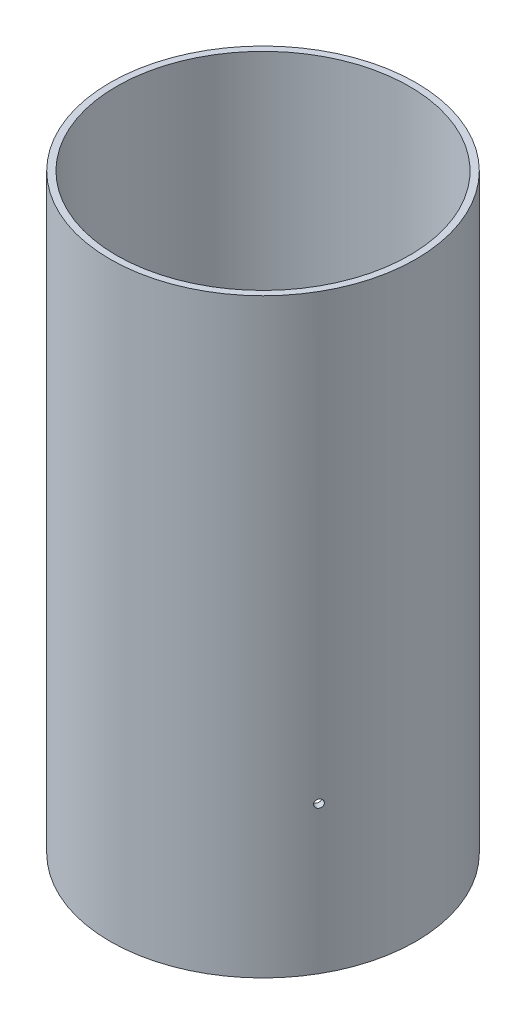
ISO-10303-21;
HEADER;
FILE_DESCRIPTION(('STEP AP214'),'2;1');
FILE_NAME('part.step','',(''),(''),'','','');
FILE_SCHEMA(('AUTOMOTIVE_DESIGN { 1 0 10303 214 1 1 1 1 }'));
ENDSEC;
DATA;
#1=APPLICATION_CONTEXT('core data for automotive mechanical design processes');
#2=APPLICATION_PROTOCOL_DEFINITION('international standard','automotive_design',2000,#1);
#3=PRODUCT_CONTEXT('',#1,'mechanical');
#4=PRODUCT('Part','Part','',(#3));
#5=PRODUCT_RELATED_PRODUCT_CATEGORY('part','',(#4));
#6=PRODUCT_DEFINITION_FORMATION('','',#4);
#7=PRODUCT_DEFINITION_CONTEXT('part definition',#1,'design');
#8=PRODUCT_DEFINITION('design','',#6,#7);
#9=PRODUCT_DEFINITION_SHAPE('','',#8);
#10=(LENGTH_UNIT() NAMED_UNIT(*) SI_UNIT(.MILLI.,.METRE.));
#11=(NAMED_UNIT(*) PLANE_ANGLE_UNIT() SI_UNIT($,.RADIAN.));
#12=(NAMED_UNIT(*) SI_UNIT($,.STERADIAN.) SOLID_ANGLE_UNIT());
#13=UNCERTAINTY_MEASURE_WITH_UNIT(LENGTH_MEASURE(1.E-05),#10,'distance_accuracy_value','');
#14=(GEOMETRIC_REPRESENTATION_CONTEXT(3) GLOBAL_UNCERTAINTY_ASSIGNED_CONTEXT((#13)) GLOBAL_UNIT_ASSIGNED_CONTEXT((#10,
#11,#12)) REPRESENTATION_CONTEXT('',''));
#15=CARTESIAN_POINT('',(0.,0.,0.));
#16=DIRECTION('',(0.,0.,1.));
#17=DIRECTION('',(1.,0.,0.));
#18=AXIS2_PLACEMENT_3D('',#15,#16,#17);
#19=CARTESIAN_POINT('',(0.,147.32,0.));
#20=DIRECTION('',(0.,1.,0.));
#21=DIRECTION('',(0.,0.,1.));
#22=AXIS2_PLACEMENT_3D('',#19,#20,#21);
#23=PLANE('',#22);
#24=CARTESIAN_POINT('',(0.,147.32,0.));
#25=DIRECTION('',(0.,1.,0.));
#26=DIRECTION('',(0.,0.,1.));
#27=AXIS2_PLACEMENT_3D('',#24,#25,#26);
#28=CIRCLE('',#27,38.1381);
#29=CARTESIAN_POINT('',(0.,147.32,38.1381));
#30=VERTEX_POINT('',#29);
#31=EDGE_CURVE('E10',#30,#30,#28,.T.);
#32=ORIENTED_EDGE('',*,*,#31,.T.);
#33=EDGE_LOOP('',(#32));
#34=FACE_BOUND('',#33,.T.);
#35=CARTESIAN_POINT('',(0.,147.32,0.));
#36=DIRECTION('',(0.,1.,0.));
#37=DIRECTION('',(0.,0.,1.));
#38=AXIS2_PLACEMENT_3D('',#35,#36,#37);
#39=CIRCLE('',#38,36.5125);
#40=CARTESIAN_POINT('',(0.,147.32,36.5125));
#41=VERTEX_POINT('',#40);
#42=EDGE_CURVE('E48',#41,#41,#39,.T.);
#43=ORIENTED_EDGE('',*,*,#42,.F.);
#44=EDGE_LOOP('',(#43));
#45=FACE_BOUND('',#44,.T.);
#46=ADVANCED_FACE('F37',(#34,#45),#23,.T.);
#47=CARTESIAN_POINT('',(0.,0.,0.));
#48=DIRECTION('',(0.,1.,0.));
#49=DIRECTION('',(0.,0.,1.));
#50=AXIS2_PLACEMENT_3D('',#47,#48,#49);
#51=PLANE('',#50);
#52=CARTESIAN_POINT('',(0.,0.,0.));
#53=DIRECTION('',(0.,1.,0.));
#54=DIRECTION('',(0.,0.,1.));
#55=AXIS2_PLACEMENT_3D('',#52,#53,#54);
#56=CIRCLE('',#55,38.1381);
#57=CARTESIAN_POINT('',(0.,0.,38.1381));
#58=VERTEX_POINT('',#57);
#59=EDGE_CURVE('E41',#58,#58,#56,.T.);
#60=ORIENTED_EDGE('',*,*,#59,.F.);
#61=EDGE_LOOP('',(#60));
#62=FACE_BOUND('',#61,.T.);
#63=CARTESIAN_POINT('',(0.,0.,0.));
#64=DIRECTION('',(0.,1.,0.));
#65=DIRECTION('',(0.,0.,1.));
#66=AXIS2_PLACEMENT_3D('',#63,#64,#65);
#67=CIRCLE('',#66,36.5125);
#68=CARTESIAN_POINT('',(0.,0.,36.5125));
#69=VERTEX_POINT('',#68);
#70=EDGE_CURVE('E50',#69,#69,#67,.T.);
#71=ORIENTED_EDGE('',*,*,#70,.T.);
#72=EDGE_LOOP('',(#71));
#73=FACE_BOUND('',#72,.T.);
#74=ADVANCED_FACE('F120',(#62,#73),#51,.F.);
#75=CARTESIAN_POINT('',(0.,147.32,0.));
#76=DIRECTION('',(0.,-1.,0.));
#77=DIRECTION('',(0.,0.,-1.));
#78=AXIS2_PLACEMENT_3D('',#75,#76,#77);
#79=CYLINDRICAL_SURFACE('',#78,38.1381);
#80=CARTESIAN_POINT('',(-32.5221202117232,36.7284,19.920501212174));
#81=CARTESIAN_POINT('',(-32.5221215941611,36.7840323666204,19.9204991651577));
#82=CARTESIAN_POINT('',(-32.5245779101229,36.8397048330967,19.9164905058717));
#83=CARTESIAN_POINT('',(-32.5343335953573,36.9495158265202,19.9005500695331));
#84=CARTESIAN_POINT('',(-32.5416387607837,37.0036524366989,19.8886088100993));
#85=CARTESIAN_POINT('',(-32.5608575802311,37.1087849851913,19.8571287803639));
#86=CARTESIAN_POINT('',(-32.5727689930754,37.1597824369011,19.837593704821));
#87=CARTESIAN_POINT('',(-32.6008190090177,37.257199333294,19.7914627232036));
#88=CARTESIAN_POINT('',(-32.6169565753903,37.3036198969029,19.7648685487878));
#89=CARTESIAN_POINT('',(-32.6529585695203,37.3905971983692,19.7053336728123));
#90=CARTESIAN_POINT('',(-32.6728241711159,37.4311520821716,19.672390972218));
#91=CARTESIAN_POINT('',(-32.7156627768417,37.5052313034338,19.6010664908007));
#92=CARTESIAN_POINT('',(-32.738635904227,37.538755361892,19.5626844942335));
#93=CARTESIAN_POINT('',(-32.7869889297891,37.5978233275431,19.4815362887579));
#94=CARTESIAN_POINT('',(-32.8123691229165,37.6233662551141,19.4387695425105));
#95=CARTESIAN_POINT('',(-32.8647699567259,37.6657404561595,19.3500444217489));
#96=CARTESIAN_POINT('',(-32.8917905916525,37.6825717601961,19.3040860584324));
#97=CARTESIAN_POINT('',(-32.9466680511753,37.7070413130619,19.2102755483439));
#98=CARTESIAN_POINT('',(-32.9745246847493,37.7146816458426,19.1624238334112));
#99=CARTESIAN_POINT('',(-33.0302743240581,37.7205587898688,19.0661674857436));
#100=CARTESIAN_POINT('',(-33.0581673296675,37.7187956334791,19.0177628549124));
#101=CARTESIAN_POINT('',(-33.1131942862079,37.7059176239083,18.9217889128774));
#102=CARTESIAN_POINT('',(-33.1403284184757,37.6948050248965,18.8742194031462));
#103=CARTESIAN_POINT('',(-33.1930955130646,37.6635470603535,18.7812656682075));
#104=CARTESIAN_POINT('',(-33.2187284725147,37.643401677547,18.7358814471796));
#105=CARTESIAN_POINT('',(-33.2678051477972,37.5946474159284,18.648601076936));
#106=CARTESIAN_POINT('',(-33.2912485958295,37.5660375035948,18.6067053544678));
#107=CARTESIAN_POINT('',(-33.3353251242614,37.5011670926021,18.527623248092));
#108=CARTESIAN_POINT('',(-33.3559582001306,37.4649065816104,18.490436871776));
#109=CARTESIAN_POINT('',(-33.3938875409941,37.3857515133327,18.4218480748162));
#110=CARTESIAN_POINT('',(-33.4111828182805,37.3428549990925,18.3904473663675));
#111=CARTESIAN_POINT('',(-33.4419909466454,37.2516525136527,18.3343650089158));
#112=CARTESIAN_POINT('',(-33.455503797139,37.2033465416167,18.3096833609514));
#113=CARTESIAN_POINT('',(-33.4784100301141,37.1026952848357,18.2677668810474));
#114=CARTESIAN_POINT('',(-33.4878033823225,37.0503499704099,18.2505321038329));
#115=CARTESIAN_POINT('',(-33.5022386368073,36.9431064342542,18.2240200760039));
#116=CARTESIAN_POINT('',(-33.5072805480223,36.8882082177685,18.2147428090437));
#117=CARTESIAN_POINT('',(-33.5128885425536,36.7774344432679,18.2044227704992));
#118=CARTESIAN_POINT('',(-33.5134559335656,36.7215591755848,18.2033775930555));
#119=CARTESIAN_POINT('',(-33.5101044688531,36.6104023115824,18.2095464508621));
#120=CARTESIAN_POINT('',(-33.5061856169737,36.5551207147543,18.2167604790335));
#121=CARTESIAN_POINT('',(-33.4939584143501,36.4467280812297,18.2392319806752));
#122=CARTESIAN_POINT('',(-33.4856506590341,36.3936167511528,18.2544883630649));
#123=CARTESIAN_POINT('',(-33.4648504240941,36.2910632998613,18.2925921107847));
#124=CARTESIAN_POINT('',(-33.4523579382902,36.2416211840652,18.3154394873247));
#125=CARTESIAN_POINT('',(-33.4234952973499,36.14779704351,18.3680573531289));
#126=CARTESIAN_POINT('',(-33.4071242409907,36.1034161983411,18.3978294513888));
#127=CARTESIAN_POINT('',(-33.3709187168574,36.0209862603299,18.4634193766467));
#128=CARTESIAN_POINT('',(-33.3510842421085,35.9829371802395,18.4992372158203));
#129=CARTESIAN_POINT('',(-33.3084557787344,35.9142417328388,18.5758812687917));
#130=CARTESIAN_POINT('',(-33.2856610862931,35.8835971309768,18.6167086735273));
#131=CARTESIAN_POINT('',(-33.2377134653269,35.8305926129208,18.7021782968252));
#132=CARTESIAN_POINT('',(-33.2125605414099,35.8082326805393,18.7468205079335));
#133=CARTESIAN_POINT('',(-33.1605744338063,35.7724353088768,18.838624015211));
#134=CARTESIAN_POINT('',(-33.1337414664642,35.7589967233412,18.8857849869168));
#135=CARTESIAN_POINT('',(-33.079129264687,35.7414197555675,18.981277692673));
#136=CARTESIAN_POINT('',(-33.0513500304459,35.7372813714236,19.0296094264834));
#137=CARTESIAN_POINT('',(-32.9956347923638,35.7384224213173,19.1260517819895));
#138=CARTESIAN_POINT('',(-32.9676988373403,35.7436990691415,19.1741624648772));
#139=CARTESIAN_POINT('',(-32.9124650708925,35.7635146780661,19.2688172565819));
#140=CARTESIAN_POINT('',(-32.8851672607374,35.7780536575875,19.315361362283));
#141=CARTESIAN_POINT('',(-32.8320109230812,35.815980926056,19.4055784248182));
#142=CARTESIAN_POINT('',(-32.8061524206428,35.8393693690445,19.4492513316583));
#143=CARTESIAN_POINT('',(-32.7566501872355,35.8943304374974,19.5325085137084));
#144=CARTESIAN_POINT('',(-32.7330063744976,35.925902760641,19.5720929398754));
#145=CARTESIAN_POINT('',(-32.6886483503258,35.9963426002907,19.6460888067003));
#146=CARTESIAN_POINT('',(-32.6679346948463,36.0352114979684,19.6804992657511));
#147=CARTESIAN_POINT('',(-32.6300784300098,36.1191506633011,19.7432013265124));
#148=CARTESIAN_POINT('',(-32.6129367070007,36.1642224655637,19.7714914095646));
#149=CARTESIAN_POINT('',(-32.5827597474882,36.2593031915053,19.8211827898113));
#150=CARTESIAN_POINT('',(-32.5697270032866,36.309315087542,19.8425799062464));
#151=CARTESIAN_POINT('',(-32.5482075316329,36.4127968909171,19.8778592700967));
#152=CARTESIAN_POINT('',(-32.5397153760402,36.4662625832123,19.8917504908014));
#153=CARTESIAN_POINT('',(-32.5298025410749,36.5547889727122,19.9079548878396));
#154=CARTESIAN_POINT('',(-32.5269256650698,36.589274904337,19.9126540709372));
#155=CARTESIAN_POINT('',(-32.5230840671011,36.6586352999251,19.9189278746615));
#156=CARTESIAN_POINT('',(-32.5221193447174,36.6935097638029,19.9205024959749));
#157=CARTESIAN_POINT('',(-32.5221202117232,36.7284,19.920501212174));
#158=B_SPLINE_CURVE_WITH_KNOTS('',3,(#80,#81,#82,#83,#84,#85,#86,#87,#88,#89,#90,#91,#92,#93,
#94,#95,#96,#97,#98,#99,#100,#101,#102,#103,#104,#105,#106,#107,#108,#109,#110,#111,#112,#113,
#114,#115,#116,#117,#118,#119,#120,#121,#122,#123,#124,#125,#126,#127,#128,#129,#130,#131,#132,
#133,#134,#135,#136,#137,#138,#139,#140,#141,#142,#143,#144,#145,#146,#147,#148,#149,#150,#151,
#152,#153,#154,#155,#156,#157),.UNSPECIFIED.,.T.,.F.,(4,2,2,2,2,2,2,2,2,2,2,2,2,2,2,2,2,2,2,2,2,
2,2,2,2,2,2,2,2,2,2,2,2,2,2,2,2,2,4),(0.,0.166769747096234,0.333739205099119,0.500627525868217,
0.66747494524511,0.834374987915555,1.00128165236311,1.16820879526826,1.33513535255086,
1.50202405393672,1.66891218092771,1.83576008238627,2.00260830294822,2.16947690414275,
2.33634577433109,2.50326394820974,2.67018214789487,2.83710157419811,3.00402065762336,
3.17089095649918,3.33776111235213,3.50460863528677,3.67145640461436,3.83834298070031,
4.00522989288339,4.17215655669926,4.33908289435486,4.50598778041511,4.67289263227433,
4.83974809976471,5.00660389910126,5.17346260300496,5.34031514385913,5.50719930020451,
5.67412481839959,5.84115139137283,6.00797783997944,6.11256870135968,6.21715953975442),.UNSPECIFIED.);
#159=CARTESIAN_POINT('',(-32.5221202117232,36.7284,19.920501212174));
#160=VERTEX_POINT('',#159);
#161=EDGE_CURVE('E102',#160,#160,#158,.T.);
#162=ORIENTED_EDGE('',*,*,#161,.F.);
#163=EDGE_LOOP('',(#162));
#164=FACE_BOUND('',#163,.T.);
#165=CARTESIAN_POINT('',(-0.990599999999602,36.7284,-38.1252328943706));
#166=CARTESIAN_POINT('',(-0.990597536012593,36.7840323666204,-38.1252330680888));
#167=CARTESIAN_POINT('',(-0.985897777254888,36.8397048330967,-38.1253559704685));
#168=CARTESIAN_POINT('',(-0.967215111821067,36.9495158265202,-38.1258344235435));
#169=CARTESIAN_POINT('',(-0.953221095084934,37.003652436699,-38.1261902526647));
#170=CARTESIAN_POINT('',(-0.916349179898552,37.1087849851913,-38.1270942236692));
#171=CARTESIAN_POINT('',(-0.893475601791379,37.1597824369011,-38.1276422720159));
#172=CARTESIAN_POINT('',(-0.839499991837998,37.257199333294,-38.1288688075898));
#173=CARTESIAN_POINT('',(-0.808399978014989,37.3036198969029,-38.1295472628158));
#174=CARTESIAN_POINT('',(-0.738840265944089,37.3905971983692,-38.1309584663315));
#175=CARTESIAN_POINT('',(-0.7003782495623,37.4311520821716,-38.1316912316777));
#176=CARTESIAN_POINT('',(-0.617190133880302,37.5052313034338,-38.1331283117902));
#177=CARTESIAN_POINT('',(-0.572463786112475,37.538755361892,-38.1338326254267));
#178=CARTESIAN_POINT('',(-0.478010865918058,37.5978233275431,-38.1351334711755));
#179=CARTESIAN_POINT('',(-0.428283680666867,37.6233662551141,-38.135729990053));
#180=CARTESIAN_POINT('',(-0.325245055228824,37.6657404561595,-38.1367478829307));
#181=CARTESIAN_POINT('',(-0.271933627617054,37.6825717601961,-38.1371692575453));
#182=CARTESIAN_POINT('',(-0.163252612977062,37.7070413130619,-38.1377892765429));
#183=CARTESIAN_POINT('',(-0.107883495443637,37.7146816458426,-38.1379879714155));
#184=CARTESIAN_POINT('',(0.0033517665664125,37.7205587898688,-38.138140401475));
#185=CARTESIAN_POINT('',(0.0592179093317223,37.7187956334791,-38.138094137505));
#186=CARTESIAN_POINT('',(0.169847259505614,37.7059176239083,-38.1377619087445));
#187=CARTESIAN_POINT('',(0.224610729512277,37.6948050248965,-38.1374760017324));
#188=CARTESIAN_POINT('',(0.331494572640285,37.6635470603535,-38.136696778661));
#189=CARTESIAN_POINT('',(0.3836149407064,37.643401677547,-38.136203462205));
#190=CARTESIAN_POINT('',(0.483740296230395,37.5946474159284,-38.1350649246111));
#191=CARTESIAN_POINT('',(0.531744780213836,37.5660375035948,-38.1344196849252));
#192=CARTESIAN_POINT('',(0.622270157536009,37.5011670926021,-38.13305002507));
#193=CARTESIAN_POINT('',(0.664791042035015,37.4649065816104,-38.132325604773));
#194=CARTESIAN_POINT('',(0.743155353048938,37.3857515133327,-38.1308789790296));
#195=CARTESIAN_POINT('',(0.778996802905529,37.3428549990925,-38.1301567743009));
#196=CARTESIAN_POINT('',(0.842969613345318,37.2516525136527,-38.128796217382));
#197=CARTESIAN_POINT('',(0.871100972736491,37.2033465416167,-38.1281578652048));
#198=CARTESIAN_POINT('',(0.918854825658149,37.1026952848357,-38.1270370049143));
#199=CARTESIAN_POINT('',(0.938477256658707,37.0503499704099,-38.1265544979462));
#200=CARTESIAN_POINT('',(0.968654973506817,36.9431064342541,-38.1257997811257));
#201=CARTESIAN_POINT('',(0.979210277979588,36.8882082177685,-38.1255275708413));
#202=CARTESIAN_POINT('',(0.990951690792746,36.7774344432679,-38.1252242172975));
#203=CARTESIAN_POINT('',(0.992140536516449,36.7215591755848,-38.1251930036059));
#204=CARTESIAN_POINT('',(0.985122416587378,36.6104023115824,-38.1253749789282));
#205=CARTESIAN_POINT('',(0.976915458987658,36.5551207147543,-38.1255881677327));
#206=CARTESIAN_POINT('',(0.951340966392979,36.4467280812297,-38.1262348504643));
#207=CARTESIAN_POINT('',(0.933974674015623,36.3936167511528,-38.1266683145071));
#208=CARTESIAN_POINT('',(0.890575743040868,36.2910632998613,-38.1277066565043));
#209=CARTESIAN_POINT('',(0.864543091645435,36.2416211840652,-38.1283115347117));
#210=CARTESIAN_POINT('',(0.804543362695946,36.14779704351,-38.1296246873392));
#211=CARTESIAN_POINT('',(0.770574441099326,36.1034161983411,-38.1303329857752));
#212=CARTESIAN_POINT('',(0.69566913752703,36.0209862603299,-38.1317730447474));
#213=CARTESIAN_POINT('',(0.654732741519545,35.9829371802395,-38.1325048053309));
#214=CARTESIAN_POINT('',(0.56704281291024,35.9142417328388,-38.1339094996104));
#215=CARTESIAN_POINT('',(0.520287897018006,35.8835971309768,-38.1345824192526));
#216=CARTESIAN_POINT('',(0.422295221507065,35.8305926129208,-38.1357933730938));
#217=CARTESIAN_POINT('',(0.371057470647625,35.8082326805393,-38.1363314075564));
#218=CARTESIAN_POINT('',(0.265560247387037,35.7724353088768,-38.1372118713665));
#219=CARTESIAN_POINT('',(0.211301164151538,35.7589967233412,-38.1375543258422));
#220=CARTESIAN_POINT('',(0.101295954201998,35.7414197555675,-38.1380051246247));
#221=CARTESIAN_POINT('',(0.0455498277926753,35.7372813714236,-38.1381134689794));
#222=CARTESIAN_POINT('',(-0.0658293211174425,35.7384224213173,-38.1380838351754));
#223=CARTESIAN_POINT('',(-0.121462372203398,35.7436990691415,-38.13794592989));
#224=CARTESIAN_POINT('',(-0.231052709633497,35.7635146780661,-38.1374394808519));
#225=CARTESIAN_POINT('',(-0.28500999264462,35.7780536575875,-38.1370709366404));
#226=CARTESIAN_POINT('',(-0.389718429483049,35.815980926056,-38.1361447291256));
#227=CARTESIAN_POINT('',(-0.440469527482833,35.8393693690445,-38.1355870625302));
#228=CARTESIAN_POINT('',(-0.537323478889344,35.8943304374974,-38.1343454618804));
#229=CARTESIAN_POINT('',(-0.583426503913181,35.925902760641,-38.1336615324906));
#230=CARTESIAN_POINT('',(-0.669687816444465,35.9963426002907,-38.1322442901085));
#231=CARTESIAN_POINT('',(-0.709844975878115,36.0352114979684,-38.1315109677835));
#232=CARTESIAN_POINT('',(-0.783074685785299,36.1191506633011,-38.1300775111234));
#233=CARTESIAN_POINT('',(-0.8161454778882,36.1642224655637,-38.1293773850589));
#234=CARTESIAN_POINT('',(-0.874267955287219,36.2593031915053,-38.1280890616354));
#235=CARTESIAN_POINT('',(-0.899314773788533,36.309315087542,-38.1275009322934));
#236=CARTESIAN_POINT('',(-0.9406273349391,36.4127968909171,-38.1265042050905));
#237=CARTESIAN_POINT('',(-0.956903562755271,36.4662625832123,-38.1260953929666));
#238=CARTESIAN_POINT('',(-0.975893399726055,36.5547889727122,-38.1256128245823));
#239=CARTESIAN_POINT('',(-0.981401449668143,36.589274904337,-38.1254709684271));
#240=CARTESIAN_POINT('',(-0.988755522056051,36.6586352999251,-38.1252809488572));
#241=CARTESIAN_POINT('',(-0.990601545306659,36.6935097638029,-38.125232785422));
#242=CARTESIAN_POINT('',(-0.990599999999602,36.7284,-38.1252328943706));
#243=B_SPLINE_CURVE_WITH_KNOTS('',3,(#165,#166,#167,#168,#169,#170,#171,#172,#173,#174,#175,
#176,#177,#178,#179,#180,#181,#182,#183,#184,#185,#186,#187,#188,#189,#190,#191,#192,#193,#194,
#195,#196,#197,#198,#199,#200,#201,#202,#203,#204,#205,#206,#207,#208,#209,#210,#211,#212,#213,
#214,#215,#216,#217,#218,#219,#220,#221,#222,#223,#224,#225,#226,#227,#228,#229,#230,#231,#232,
#233,#234,#235,#236,#237,#238,#239,#240,#241,#242),.UNSPECIFIED.,.T.,.F.,(4,2,2,2,2,2,2,2,2,2,2,
2,2,2,2,2,2,2,2,2,2,2,2,2,2,2,2,2,2,2,2,2,2,2,2,2,2,2,4),(0.,0.166769747096233,0.33373920509912,
0.500627525868212,0.66747494524511,0.834374987915561,1.00128165236311,1.16820879526826,
1.33513535255086,1.50202405393672,1.66891218092771,1.83576008238628,2.00260830294822,
2.16947690414276,2.33634577433109,2.50326394820974,2.67018214789486,2.83710157419811,
3.00402065762335,3.17089095649917,3.33776111235213,3.50460863528676,3.67145640461436,
3.8383429807003,4.00522989288339,4.17215655669925,4.33908289435486,4.5059877804151,
4.67289263227432,4.83974809976471,5.00660389910126,5.17346260300496,5.34031514385913,
5.5071993002045,5.67412481839958,5.84115139137283,6.00797783997943,6.11256870135968,
6.21715953975442),.UNSPECIFIED.);
#244=CARTESIAN_POINT('',(-0.990599999999602,36.7284,-38.1252328943706));
#245=VERTEX_POINT('',#244);
#246=EDGE_CURVE('E79',#245,#245,#243,.T.);
#247=ORIENTED_EDGE('',*,*,#246,.F.);
#248=EDGE_LOOP('',(#247));
#249=FACE_BOUND('',#248,.T.);
#250=CARTESIAN_POINT('',(33.5127202117231,36.7284,18.2047316821965));
#251=CARTESIAN_POINT('',(33.5127191301739,36.7840323666204,18.2047339029309));
#252=CARTESIAN_POINT('',(33.510475687378,36.8397048330967,18.2088654645966));
#253=CARTESIAN_POINT('',(33.5015487071786,36.9495158265202,18.2252843540102));
#254=CARTESIAN_POINT('',(33.4948598558689,37.0036524366989,18.2375814425653));
#255=CARTESIAN_POINT('',(33.4772067601299,37.1087849851913,18.2699654433051));
#256=CARTESIAN_POINT('',(33.4662445948671,37.1597824369011,18.2900485671947));
#257=CARTESIAN_POINT('',(33.440319000856,37.257199333294,18.337406084386));
#258=CARTESIAN_POINT('',(33.4253565534055,37.3036198969029,18.3646787140278));
#259=CARTESIAN_POINT('',(33.3917988354646,37.3905971983692,18.425624793519));
#260=CARTESIAN_POINT('',(33.3732024206785,37.4311520821716,18.4593002594595));
#261=CARTESIAN_POINT('',(33.3328529107222,37.5052313034338,18.5320618209893));
#262=CARTESIAN_POINT('',(33.3110996903397,37.538755361892,18.571148131193));
#263=CARTESIAN_POINT('',(33.2649997957074,37.5978233275431,18.6535971824174));
#264=CARTESIAN_POINT('',(33.2406528035836,37.6233662551141,18.6969604475424));
#265=CARTESIAN_POINT('',(33.190015011955,37.6657404561595,18.7867034611816));
#266=CARTESIAN_POINT('',(33.1637242192698,37.6825717601961,18.8330831991127));
#267=CARTESIAN_POINT('',(33.1099206641526,37.7070413130619,18.9275137281988));
#268=CARTESIAN_POINT('',(33.0824081801932,37.7146816458426,18.9755641380042));
#269=CARTESIAN_POINT('',(33.026922557492,37.7205587898688,19.0719729157313));
#270=CARTESIAN_POINT('',(32.998949420336,37.7187956334791,19.1203312825925));
#271=CARTESIAN_POINT('',(32.9433470267026,37.7059176239083,19.215972995867));
#272=CARTESIAN_POINT('',(32.9157176889636,37.6948050248965,19.2632565985861));
#273=CARTESIAN_POINT('',(32.8616009404246,37.6635470603535,19.3554311104533));
#274=CARTESIAN_POINT('',(32.8351135318085,37.643401677547,19.4003220150252));
#275=CARTESIAN_POINT('',(32.7840648515671,37.5946474159284,19.486463847675));
#276=CARTESIAN_POINT('',(32.7595038156159,37.5660375035948,19.5277143304573));
#277=CARTESIAN_POINT('',(32.7130549667257,37.5011670926021,19.6054267769778));
#278=CARTESIAN_POINT('',(32.6911671580959,37.4649065816104,19.6418887329968));
#279=CARTESIAN_POINT('',(32.6507321879454,37.3857515133327,19.7090309042133));
#280=CARTESIAN_POINT('',(32.6321860153753,37.3428549990925,19.7397094079332));
#281=CARTESIAN_POINT('',(32.5990213333004,37.2516525136527,19.7944312084661));
#282=CARTESIAN_POINT('',(32.5844028244028,37.2033465416167,19.8184745042532));
#283=CARTESIAN_POINT('',(32.5595552044562,37.1026952848357,19.8592701238667));
#284=CARTESIAN_POINT('',(32.5493261256641,37.0503499704099,19.8760223941131));
#285=CARTESIAN_POINT('',(32.5335836633008,36.9431064342541,19.9017797051216));
#286=CARTESIAN_POINT('',(32.528070270043,36.8882082177685,19.9107847617975));
#287=CARTESIAN_POINT('',(32.5219368517611,36.7774344432679,19.9208014467981));
#288=CARTESIAN_POINT('',(32.5213153970494,36.7215591755848,19.9218154105502));
#289=CARTESIAN_POINT('',(32.524982052266,36.6104023115824,19.915828528066));
#290=CARTESIAN_POINT('',(32.5292701579863,36.5551207147543,19.9088276886991));
#291=CARTESIAN_POINT('',(32.5426174479574,36.4467280812297,19.887002869789));
#292=CARTESIAN_POINT('',(32.5516759850188,36.3936167511528,19.8721799514421));
#293=CARTESIAN_POINT('',(32.5742746810535,36.2910632998613,19.8351145457194));
#294=CARTESIAN_POINT('',(32.5878148466451,36.2416211840652,19.8128720473868));
#295=CARTESIAN_POINT('',(32.6189519346542,36.14779704351,19.7615673342101));
#296=CARTESIAN_POINT('',(32.6365497998916,36.1034161983411,19.7325035343863));
#297=CARTESIAN_POINT('',(32.6752495793306,36.0209862603299,19.6683536681006));
#298=CARTESIAN_POINT('',(32.6963515005892,35.9829371802395,19.6332675895105));
#299=CARTESIAN_POINT('',(32.7414129658244,35.9142417328388,19.5580282308186));
#300=CARTESIAN_POINT('',(32.7653731892754,35.8835971309769,19.5178737457252));
#301=CARTESIAN_POINT('',(32.8154182438201,35.8305926129208,19.4336150762685));
#302=CARTESIAN_POINT('',(32.8415030707625,35.8082326805393,19.3895108996227));
#303=CARTESIAN_POINT('',(32.8950141864195,35.7724353088768,19.2985878561554));
#304=CARTESIAN_POINT('',(32.9224403023129,35.7589967233412,19.2517693389253));
#305=CARTESIAN_POINT('',(32.9778333104853,35.7414197555675,19.1567274319516));
#306=CARTESIAN_POINT('',(33.0058002026535,35.7372813714236,19.1085040424959));
#307=CARTESIAN_POINT('',(33.0614641134815,35.7384224213173,19.0120320531858));
#308=CARTESIAN_POINT('',(33.089161209544,35.7436990691415,18.9637834650126));
#309=CARTESIAN_POINT('',(33.1435177805262,35.7635146780661,18.8686222242698));
#310=CARTESIAN_POINT('',(33.1701772533823,35.7780536575875,18.8217095743573));
#311=CARTESIAN_POINT('',(33.2217293525645,35.815980926056,18.7305663043072));
#312=CARTESIAN_POINT('',(33.2466219481259,35.8393693690445,18.6863357308717));
#313=CARTESIAN_POINT('',(33.2939736661251,35.8943304374974,18.6018369481719));
#314=CARTESIAN_POINT('',(33.3164328784111,35.925902760641,18.561568592615));
#315=CARTESIAN_POINT('',(33.3583361667705,35.9963426002907,18.4861554834081));
#316=CARTESIAN_POINT('',(33.3777796707247,36.0352114979684,18.4510117020322));
#317=CARTESIAN_POINT('',(33.4131531157954,36.1191506633011,18.3868761846108));
#318=CARTESIAN_POINT('',(33.4290821848891,36.1642224655637,18.3578859754941));
#319=CARTESIAN_POINT('',(33.4570277027756,36.2593031915053,18.306906271824));
#320=CARTESIAN_POINT('',(33.4690417770754,36.309315087542,18.2849210260469));
#321=CARTESIAN_POINT('',(33.4888348665723,36.4127968909171,18.2486449349936));
#322=CARTESIAN_POINT('',(33.4966189387958,36.4662625832123,18.2343449021651));
#323=CARTESIAN_POINT('',(33.5056959408012,36.5547889727122,18.2176579367425));
#324=CARTESIAN_POINT('',(33.5083271147382,36.589274904337,18.2128168974897));
#325=CARTESIAN_POINT('',(33.5118395891575,36.6586352999251,18.2063530741956));
#326=CARTESIAN_POINT('',(33.5127208900243,36.6935097638029,18.204730289447));
#327=CARTESIAN_POINT('',(33.5127202117231,36.7284,18.2047316821965));
#328=B_SPLINE_CURVE_WITH_KNOTS('',3,(#250,#251,#252,#253,#254,#255,#256,#257,#258,#259,#260,
#261,#262,#263,#264,#265,#266,#267,#268,#269,#270,#271,#272,#273,#274,#275,#276,#277,#278,#279,
#280,#281,#282,#283,#284,#285,#286,#287,#288,#289,#290,#291,#292,#293,#294,#295,#296,#297,#298,
#299,#300,#301,#302,#303,#304,#305,#306,#307,#308,#309,#310,#311,#312,#313,#314,#315,#316,#317,
#318,#319,#320,#321,#322,#323,#324,#325,#326,#327),.UNSPECIFIED.,.T.,.F.,(4,2,2,2,2,2,2,2,2,2,2,
2,2,2,2,2,2,2,2,2,2,2,2,2,2,2,2,2,2,2,2,2,2,2,2,2,2,2,4),(0.,0.166769747096233,0.33373920509912,
0.500627525868217,0.66747494524511,0.834374987915557,1.00128165236311,1.16820879526826,
1.33513535255086,1.50202405393672,1.66891218092771,1.83576008238628,2.00260830294823,
2.16947690414276,2.3363457743311,2.50326394820975,2.67018214789487,2.83710157419812,
3.00402065762336,3.17089095649918,3.33776111235213,3.50460863528676,3.67145640461436,
3.8383429807003,4.00522989288339,4.17215655669925,4.33908289435486,4.50598778041511,
4.67289263227432,4.83974809976471,5.00660389910126,5.17346260300495,5.34031514385913,
5.5071993002045,5.67412481839958,5.84115139137283,6.00797783997943,6.11256870135968,
6.21715953975442),.UNSPECIFIED.);
#329=CARTESIAN_POINT('',(33.5127202117231,36.7284,18.2047316821965));
#330=VERTEX_POINT('',#329);
#331=EDGE_CURVE('E63',#330,#330,#328,.T.);
#332=ORIENTED_EDGE('',*,*,#331,.F.);
#333=EDGE_LOOP('',(#332));
#334=FACE_BOUND('',#333,.T.);
#335=ORIENTED_EDGE('',*,*,#31,.F.);
#336=EDGE_LOOP('',(#335));
#337=FACE_BOUND('',#336,.T.);
#338=ORIENTED_EDGE('',*,*,#59,.T.);
#339=EDGE_LOOP('',(#338));
#340=FACE_BOUND('',#339,.T.);
#341=ADVANCED_FACE('F39',(#164,#249,#334,#337,#340),#79,.T.);
#342=CARTESIAN_POINT('',(0.,147.32,0.));
#343=DIRECTION('',(0.,-1.,0.));
#344=DIRECTION('',(0.,0.,-1.));
#345=AXIS2_PLACEMENT_3D('',#342,#343,#344);
#346=CYLINDRICAL_SURFACE('',#345,36.5125);
#347=CARTESIAN_POINT('',(-31.1138130201008,36.7284,19.1074146759891));
#348=CARTESIAN_POINT('',(-31.1138144090538,36.7840314498783,19.1074126331032));
#349=CARTESIAN_POINT('',(-31.1162753864208,36.8397029772048,19.1034068432249));
#350=CARTESIAN_POINT('',(-31.1260491931922,36.9495120553044,19.0874776182202));
#351=CARTESIAN_POINT('',(-31.133367826253,37.0036476903076,19.0755447122023));
#352=CARTESIAN_POINT('',(-31.152620789201,37.1087782834648,19.0440860204969));
#353=CARTESIAN_POINT('',(-31.1645528707628,37.1597747574511,19.0245639333081));
#354=CARTESIAN_POINT('',(-31.1926490465143,37.2571898922812,18.9784621837009));
#355=CARTESIAN_POINT('',(-31.2088121041081,37.303609670593,18.9518842499537));
#356=CARTESIAN_POINT('',(-31.2448673546156,37.3905865898821,18.8923827804));
#357=CARTESIAN_POINT('',(-31.2647607934301,37.4311417641163,18.85945712443));
#358=CARTESIAN_POINT('',(-31.3076540054236,37.5052217766538,18.7881660574251));
#359=CARTESIAN_POINT('',(-31.3306539019326,37.5387463356987,18.749800430414));
#360=CARTESIAN_POINT('',(-31.3790567181071,37.5978159088445,18.668681887152));
#361=CARTESIAN_POINT('',(-31.4044599631225,37.6233598405596,18.6259283768308));
#362=CARTESIAN_POINT('',(-31.4569003165631,37.6657359733015,18.5372255365305));
#363=CARTESIAN_POINT('',(-31.4839374190332,37.6825682060791,18.4912762181996));
#364=CARTESIAN_POINT('',(-31.5388387916365,37.7070391746367,18.3974795713472));
#365=CARTESIAN_POINT('',(-31.5667028553164,37.7146801855758,18.3496327155652));
#366=CARTESIAN_POINT('',(-31.6224579880435,37.7205588152272,18.2533805061903));
#367=CARTESIAN_POINT('',(-31.6503490569934,37.7187964677065,18.2049751546035));
#368=CARTESIAN_POINT('',(-31.705362335732,37.7059203399649,18.108995420389));
#369=CARTESIAN_POINT('',(-31.7324847458051,37.694809019339,18.0614208225606));
#370=CARTESIAN_POINT('',(-31.7852205128908,37.6635541578024,17.9684521118504));
#371=CARTESIAN_POINT('',(-31.8108338669001,37.643410598916,17.9230580033084));
#372=CARTESIAN_POINT('',(-31.8598659257373,37.5946602436045,17.8357536788027));
#373=CARTESIAN_POINT('',(-31.8832843376279,37.5660523196356,17.793843927946));
#374=CARTESIAN_POINT('',(-31.9273079430066,37.5011861552155,17.7147316249569));
#375=CARTESIAN_POINT('',(-31.9479131314434,37.4649279010281,17.6775290812765));
#376=CARTESIAN_POINT('',(-31.9857875580788,37.3857763901464,17.6089065724584));
#377=CARTESIAN_POINT('',(-32.0030557188069,37.3428809984547,17.5774884751761));
#378=CARTESIAN_POINT('',(-32.0338129297786,37.2516803960296,17.5213730261171));
#379=CARTESIAN_POINT('',(-32.047301979428,37.2033751844457,17.4966756753971));
#380=CARTESIAN_POINT('',(-32.0701666755444,37.1027249595803,17.4547311386167));
#381=CARTESIAN_POINT('',(-32.0795422888133,37.0503799136987,17.4374840126843));
#382=CARTESIAN_POINT('',(-32.0939501554805,36.9431364631844,17.410951999662));
#383=CARTESIAN_POINT('',(-32.0989824185963,36.8882380642647,17.401667094758));
#384=CARTESIAN_POINT('',(-32.1045802695781,36.7774650413427,17.3913374197299));
#385=CARTESIAN_POINT('',(-32.1051472811971,36.7215907342057,17.3902900230624));
#386=CARTESIAN_POINT('',(-32.1018046288011,36.6104355046575,17.3964596301024));
#387=CARTESIAN_POINT('',(-32.0978949689911,36.5551545816889,17.403676626047));
#388=CARTESIAN_POINT('',(-32.0856948663098,36.446763685072,17.4261585853686));
#389=CARTESIAN_POINT('',(-32.0774050719947,36.3936533912776,17.4414223572775));
#390=CARTESIAN_POINT('',(-32.0566476133141,36.2911015476563,17.4795442840116));
#391=CARTESIAN_POINT('',(-32.0441799421691,36.2416600037826,17.5024024511601));
#392=CARTESIAN_POINT('',(-32.0153708166263,36.1478353772574,17.5550444264956));
#393=CARTESIAN_POINT('',(-31.9990283800541,36.1034535813798,17.5848299906005));
#394=CARTESIAN_POINT('',(-31.962880979801,36.0210212156452,17.6504474461421));
#395=CARTESIAN_POINT('',(-31.9430760086387,35.9829706594681,17.6862793506428));
#396=CARTESIAN_POINT('',(-31.9005037098787,35.9142709404092,17.7629513000151));
#397=CARTESIAN_POINT('',(-31.8777356137473,35.8836237036065,17.803792644006));
#398=CARTESIAN_POINT('',(-31.8298356913479,35.8306137667082,17.8892876854819));
#399=CARTESIAN_POINT('',(-31.8047038698911,35.8082510497507,17.9339413752073));
#400=CARTESIAN_POINT('',(-31.7527524138401,35.7724483218917,18.0257635143256));
#401=CARTESIAN_POINT('',(-31.7259330162367,35.7590070611748,18.0729316104723));
#402=CARTESIAN_POINT('',(-31.6713386619802,35.7414246928786,18.1684338268078));
#403=CARTESIAN_POINT('',(-31.6435637056976,35.737283581694,18.2167679465445));
#404=CARTESIAN_POINT('',(-31.5878480481634,35.7384192142672,18.3132086838061));
#405=CARTESIAN_POINT('',(-31.55990740328,35.7436929198363,18.3613153697018));
#406=CARTESIAN_POINT('',(-31.504655128875,35.7635022439887,18.4559574465736));
#407=CARTESIAN_POINT('',(-31.477343500603,35.7780378809694,18.5024928344284));
#408=CARTESIAN_POINT('',(-31.4241519610715,35.8159581012183,18.5926887082602));
#409=CARTESIAN_POINT('',(-31.398272074488,35.8393428369461,18.63634914469));
#410=CARTESIAN_POINT('',(-31.3487218428655,35.8942962140839,18.7195791577504));
#411=CARTESIAN_POINT('',(-31.3250514167169,35.9258645549118,18.7591488845572));
#412=CARTESIAN_POINT('',(-31.2806372209722,35.9962972664739,18.833115947485));
#413=CARTESIAN_POINT('',(-31.2598940852979,36.0351632133133,18.8675121633579));
#414=CARTESIAN_POINT('',(-31.221979841929,36.1190969161858,18.9301869140256));
#415=CARTESIAN_POINT('',(-31.2048096206018,36.1641662065461,18.9584639308408));
#416=CARTESIAN_POINT('',(-31.1745795346949,36.2592430906149,19.0081323561046));
#417=CARTESIAN_POINT('',(-31.1615222132061,36.3092537146481,19.0295195045904));
#418=CARTESIAN_POINT('',(-31.1399604338971,36.4127337960748,19.0647830220124));
#419=CARTESIAN_POINT('',(-31.1314505417361,36.4661990389997,19.0786683561055));
#420=CARTESIAN_POINT('',(-31.1215147874562,36.5547354700358,19.0948690286459));
#421=CARTESIAN_POINT('',(-31.1186306507859,36.5892318703441,19.0995679649402));
#422=CARTESIAN_POINT('',(-31.1147793316499,36.6586135892183,19.1058414290517));
#423=CARTESIAN_POINT('',(-31.1138121487237,36.6934989076908,19.1074159576194));
#424=CARTESIAN_POINT('',(-31.1138130201008,36.7284,19.1074146759891));
#425=B_SPLINE_CURVE_WITH_KNOTS('',3,(#347,#348,#349,#350,#351,#352,#353,#354,#355,#356,#357,
#358,#359,#360,#361,#362,#363,#364,#365,#366,#367,#368,#369,#370,#371,#372,#373,#374,#375,#376,
#377,#378,#379,#380,#381,#382,#383,#384,#385,#386,#387,#388,#389,#390,#391,#392,#393,#394,#395,
#396,#397,#398,#399,#400,#401,#402,#403,#404,#405,#406,#407,#408,#409,#410,#411,#412,#413,#414,
#415,#416,#417,#418,#419,#420,#421,#422,#423,#424),.UNSPECIFIED.,.T.,.F.,(4,2,2,2,2,2,2,2,2,2,2,
2,2,2,2,2,2,2,2,2,2,2,2,2,2,2,2,2,2,2,2,2,2,2,2,2,2,2,4),(0.,0.166766956919953,
0.333733517220423,0.500618810121911,0.667463254065226,0.834363521541396,1.00127041710032,
1.16819993986948,1.3351288542413,1.50201643917372,1.66890342481961,1.83574651836026,
2.00258994394506,2.16945560486794,2.33632156540249,2.50324131447525,2.6701610897945,
2.83708221223862,3.00400296122343,3.17087048509002,3.33773785221838,3.50458051860712,
3.67142345572944,3.83830872944593,4.00519436374423,4.17212336907327,4.33905203464088,
4.50595731007236,4.67286252080083,4.83971388046819,5.00656557156277,5.17342013744892,
5.34026857567274,5.50715309063505,5.67407895702334,5.84110783543114,6.00793665941579,
6.11256004004429,6.21718339554398),.UNSPECIFIED.);
#426=CARTESIAN_POINT('',(-31.1138130201008,36.7284,19.1074146759891));
#427=VERTEX_POINT('',#426);
#428=EDGE_CURVE('E85',#427,#427,#425,.T.);
#429=ORIENTED_EDGE('',*,*,#428,.T.);
#430=EDGE_LOOP('',(#429));
#431=FACE_BOUND('',#430,.T.);
#432=CARTESIAN_POINT('',(-0.990599999999623,36.7284,-36.4990598220009));
#433=CARTESIAN_POINT('',(-0.990597536332029,36.7840314498783,-36.4990600034265));
#434=CARTESIAN_POINT('',(-0.985897931851702,36.8397029772048,-36.4991883774053));
#435=CARTESIAN_POINT('',(-0.967215914949325,36.9495120553044,-36.4996881298586));
#436=CARTESIAN_POINT('',(-0.953222398666416,37.0036476903076,-36.5000597990013));
#437=CARTESIAN_POINT('',(-0.916351891005747,37.1087782834648,-36.5010040081598));
#438=CARTESIAN_POINT('',(-0.893479226784451,37.1597747574511,-36.5015764503179));
#439=CARTESIAN_POINT('',(-0.839505852589964,37.2571898922811,-36.5028575774643));
#440=CARTESIAN_POINT('',(-0.808407157987858,37.303609670593,-36.5035662290697));
#441=CARTESIAN_POINT('',(-0.738849748538114,37.3905865898821,-36.5050402571722));
#442=CARTESIAN_POINT('',(-0.700388574624589,37.4311417641163,-36.5058056525692));
#443=CARTESIAN_POINT('',(-0.617202093538681,37.5052217766538,-36.5073067303031));
#444=CARTESIAN_POINT('',(-0.572476537660466,37.5387463356987,-36.5080424114587));
#445=CARTESIAN_POINT('',(-0.478024410390375,37.5978159088445,-36.5094012082495));
#446=CARTESIAN_POINT('',(-0.428297161843535,37.6233598405596,-36.5100243086108));
#447=CARTESIAN_POINT('',(-0.325258072035315,37.6657359733015,-36.5110875667237));
#448=CARTESIAN_POINT('',(-0.271946243839131,37.6825682060791,-36.511527725142));
#449=CARTESIAN_POINT('',(-0.163265278573513,37.7070391746367,-36.5121753850929));
#450=CARTESIAN_POINT('',(-0.107896654135118,37.7146801855758,-36.5123829442014));
#451=CARTESIAN_POINT('',(0.00333777071751081,37.7205588152272,-36.512542200847));
#452=CARTESIAN_POINT('',(0.0592035693456927,37.7187964677065,-36.5124938993029));
#453=CARTESIAN_POINT('',(0.169831096793194,37.7059203399649,-36.5121469291287));
#454=CARTESIAN_POINT('',(0.224593112124024,37.694809019339,-36.5118483263497));
#455=CARTESIAN_POINT('',(0.331474260898963,37.6635541578024,-36.5110344849789));
#456=CARTESIAN_POINT('',(0.383593389083102,37.643410598916,-36.510519245956));
#457=CARTESIAN_POINT('',(0.483717181383893,37.5946602436045,-36.5093300922561));
#458=CARTESIAN_POINT('',(0.531721296237398,37.5660523196356,-36.5086561564413));
#459=CARTESIAN_POINT('',(0.622246363067208,37.5011861552155,-36.5072255655709));
#460=CARTESIAN_POINT('',(0.664767305198196,37.4649279010281,-36.5064689103667));
#461=CARTESIAN_POINT('',(0.743133354423782,37.3857763901464,-36.5049578715776));
#462=CARTESIAN_POINT('',(0.778976305172914,37.3428809984547,-36.5042034888036));
#463=CARTESIAN_POINT('',(0.842952315088666,37.2516803960296,-36.5027822903252));
#464=CARTESIAN_POINT('',(0.87108537304298,37.2033751844457,-36.5021154746345));
#465=CARTESIAN_POINT('',(0.918842755503024,37.1027249595803,-36.5009446139309));
#466=CARTESIAN_POINT('',(0.938467011337248,37.0503799136987,-36.5004405702316));
#467=CARTESIAN_POINT('',(0.968648341961652,36.9431364631844,-36.4996521422686));
#468=CARTESIAN_POINT('',(0.979205437038101,36.8882380642647,-36.4993677575134));
#469=CARTESIAN_POINT('',(0.990950123516218,36.7774650413427,-36.4990508011562));
#470=CARTESIAN_POINT('',(0.992140701447557,36.7215907342057,-36.4990181492888));
#471=CARTESIAN_POINT('',(0.985126338821619,36.6104355046575,-36.4992081309178));
#472=CARTESIAN_POINT('',(0.976921407089525,36.5551545816889,-36.4994307641745));
#473=CARTESIAN_POINT('',(0.95135140784952,36.446763685072,-36.5001061449845));
#474=CARTESIAN_POINT('',(0.933987696461339,36.3936533912776,-36.50055885847));
#475=CARTESIAN_POINT('',(0.890594410128072,36.2911015476563,-36.5016433353016));
#476=CARTESIAN_POINT('',(0.86456482112104,36.2416600037826,-36.5022750989382));
#477=CARTESIAN_POINT('',(0.804570970403698,36.1478353772573,-36.5036466520251));
#478=CARTESIAN_POINT('',(0.770604696936769,36.1034535813798,-36.5043864688463));
#479=CARTESIAN_POINT('',(0.695704613379437,36.0210212156452,-36.5058906297171));
#480=CARTESIAN_POINT('',(0.654770788234738,35.9829706594681,-36.5066549738197));
#481=CARTESIAN_POINT('',(0.567084782940599,35.9142709404092,-36.5081222562822));
#482=CARTESIAN_POINT('',(0.52033109345412,35.8836237036065,-36.5088251786321));
#483=CARTESIAN_POINT('',(0.422340254438686,35.8306137667082,-36.5100901497329));
#484=CARTESIAN_POINT('',(0.371103114035403,35.8082510497507,-36.5106521987706));
#485=CARTESIAN_POINT('',(0.265607080903622,35.7724483218917,-36.511571987626));
#486=CARTESIAN_POINT('',(0.211348612590696,35.7590070611748,-36.5119297560606));
#487=CARTESIAN_POINT('',(0.101344089998227,35.7414246928786,-36.512400766539));
#488=CARTESIAN_POINT('',(0.045598036295376,35.737283581694,-36.5125140086776));
#489=CARTESIAN_POINT('',(-0.0657799208999709,35.7384192142672,-36.5124832024952));
#490=CARTESIAN_POINT('',(-0.121411855419275,35.7436929198363,-36.5123392371759));
#491=CARTESIAN_POINT('',(-0.231000435459682,35.7635022439887,-36.5118104023603));
#492=CARTESIAN_POINT('',(-0.284957077652835,35.7780378809694,-36.5114255323854));
#493=CARTESIAN_POINT('',(-0.389664765473484,35.8159581012183,-36.5104582448006));
#494=CARTESIAN_POINT('',(-0.440415755853746,35.8393428369461,-36.5098758237871));
#495=CARTESIAN_POINT('',(-0.537270177332618,35.8942962140839,-36.5085790709688));
#496=CARTESIAN_POINT('',(-0.583373779042401,35.9258645549118,-36.5078647440091));
#497=CARTESIAN_POINT('',(-0.669638232453608,35.9962972664739,-36.5063844536695));
#498=CARTESIAN_POINT('',(-0.709797797030743,36.0351632133133,-36.5056184791579));
#499=CARTESIAN_POINT('',(-0.783032844969183,36.1190969161858,-36.504121156569));
#500=CARTESIAN_POINT('',(-0.816106570538011,36.1641662065461,-36.5033898171186));
#501=CARTESIAN_POINT('',(-0.874235731535964,36.2592430906149,-36.5020440073966));
#502=CARTESIAN_POINT('',(-0.899286206183547,36.3092537146481,-36.5014296095248));
#503=CARTESIAN_POINT('',(-0.94060619775227,36.4127337960748,-36.5003883196034));
#504=CARTESIAN_POINT('',(-0.95688619589742,36.4661990389997,-36.4999612038551));
#505=CARTESIAN_POINT('',(-0.975884267015759,36.5547354700358,-36.4994569245131));
#506=CARTESIAN_POINT('',(-0.98139573355251,36.5892318703441,-36.4993086570358));
#507=CARTESIAN_POINT('',(-0.988754372410873,36.6586135892183,-36.4991100488817));
#508=CARTESIAN_POINT('',(-0.990601545612587,36.6934989076908,-36.4990597081813));
#509=CARTESIAN_POINT('',(-0.990599999999623,36.7284,-36.4990598220009));
#510=B_SPLINE_CURVE_WITH_KNOTS('',3,(#432,#433,#434,#435,#436,#437,#438,#439,#440,#441,#442,
#443,#444,#445,#446,#447,#448,#449,#450,#451,#452,#453,#454,#455,#456,#457,#458,#459,#460,#461,
#462,#463,#464,#465,#466,#467,#468,#469,#470,#471,#472,#473,#474,#475,#476,#477,#478,#479,#480,
#481,#482,#483,#484,#485,#486,#487,#488,#489,#490,#491,#492,#493,#494,#495,#496,#497,#498,#499,
#500,#501,#502,#503,#504,#505,#506,#507,#508,#509),.UNSPECIFIED.,.T.,.F.,(4,2,2,2,2,2,2,2,2,2,2,
2,2,2,2,2,2,2,2,2,2,2,2,2,2,2,2,2,2,2,2,2,2,2,2,2,2,2,4),(0.,0.166766956919953,
0.333733517220422,0.500618810121904,0.667463254065226,0.834363521541396,1.00127041710032,
1.16819993986948,1.3351288542413,1.50201643917372,1.66890342481961,1.83574651836026,
2.00258994394506,2.16945560486794,2.33632156540249,2.50324131447525,2.6701610897945,
2.83708221223862,3.00400296122343,3.17087048509002,3.33773785221838,3.50458051860712,
3.67142345572944,3.83830872944593,4.00519436374423,4.17212336907328,4.33905203464087,
4.50595731007236,4.67286252080082,4.83971388046819,5.00656557156277,5.17342013744892,
5.34026857567273,5.50715309063505,5.67407895702334,5.84110783543114,6.00793665941579,
6.11256004004429,6.21718339554398),.UNSPECIFIED.);
#511=CARTESIAN_POINT('',(-0.990599999999623,36.7284,-36.4990598220009));
#512=VERTEX_POINT('',#511);
#513=EDGE_CURVE('E86',#512,#512,#510,.T.);
#514=ORIENTED_EDGE('',*,*,#513,.T.);
#515=EDGE_LOOP('',(#514));
#516=FACE_BOUND('',#515,.T.);
#517=CARTESIAN_POINT('',(32.1044130201007,36.7284,17.3916451460116));
#518=CARTESIAN_POINT('',(32.1044119453861,36.7840314498783,17.3916473703231));
#519=CARTESIAN_POINT('',(32.1021733182728,36.8397029772048,17.3957815341803));
#520=CARTESIAN_POINT('',(32.0932651081418,36.9495120553044,17.4122105116383));
#521=CARTESIAN_POINT('',(32.0865902249196,37.0036476903076,17.4245150867989));
#522=CARTESIAN_POINT('',(32.068972680207,37.1087782834648,17.4569179876627));
#523=CARTESIAN_POINT('',(32.0580320975475,37.1597747574511,17.4770125170096));
#524=CARTESIAN_POINT('',(32.0321548991045,37.2571898922812,17.5243953937632));
#525=CARTESIAN_POINT('',(32.0172192620962,37.303609670593,17.5516819791159));
#526=CARTESIAN_POINT('',(31.9837171031539,37.3905865898821,17.612657476772));
#527=CARTESIAN_POINT('',(31.9651493680549,37.4311417641163,17.646348528139));
#528=CARTESIAN_POINT('',(31.9248560989626,37.5052217766538,17.7191406728778));
#529=CARTESIAN_POINT('',(31.9031304395934,37.5387463356987,17.7582419810445));
#530=CARTESIAN_POINT('',(31.8570811284977,37.5978159088445,17.8407193210973));
#531=CARTESIAN_POINT('',(31.8327571249663,37.6233598405596,17.8840959317798));
#532=CARTESIAN_POINT('',(31.7821583885987,37.6657359733015,17.973862030193));
#533=CARTESIAN_POINT('',(31.7558836628726,37.6825682060791,18.0202515069423));
#534=CARTESIAN_POINT('',(31.7021040702103,37.7070391746367,18.1146958137456));
#535=CARTESIAN_POINT('',(31.6745995094518,37.7146801855758,18.162750228636));
#536=CARTESIAN_POINT('',(31.6191202173263,37.7205588152272,18.2591616946566));
#537=CARTESIAN_POINT('',(31.591145487648,37.7187964677065,18.3075187446993));
#538=CARTESIAN_POINT('',(31.535531238939,37.7059203399649,18.4031515087396));
#539=CARTESIAN_POINT('',(31.5078916336814,37.694809019339,18.450427503789));
#540=CARTESIAN_POINT('',(31.4537462519921,37.6635541578024,18.5425823731283));
#541=CARTESIAN_POINT('',(31.4272404778172,37.643410598916,18.5874612426475));
#542=CARTESIAN_POINT('',(31.3761487443536,37.5946602436045,18.6735764134532));
#543=CARTESIAN_POINT('',(31.3515630413908,37.5660523196356,18.7148122284951));
#544=CARTESIAN_POINT('',(31.3050615799397,37.5011861552155,18.7924939406138));
#545=CARTESIAN_POINT('',(31.2831458262455,37.4649279010281,18.82893982909));
#546=CARTESIAN_POINT('',(31.2426542036552,37.3857763901464,18.8960512991191));
#547=CARTESIAN_POINT('',(31.2240794136342,37.3428809984547,18.9267150136274));
#548=CARTESIAN_POINT('',(31.1908606146902,37.2516803960296,18.981409264208));
#549=CARTESIAN_POINT('',(31.1762166063852,37.2033751844457,19.0054397992372));
#550=CARTESIAN_POINT('',(31.1513239200416,37.1027249595803,19.0462134753141));
#551=CARTESIAN_POINT('',(31.1410752774763,37.0503799136987,19.0629565575472));
#552=CARTESIAN_POINT('',(31.1253018135191,36.9431364631844,19.0887001426065));
#553=CARTESIAN_POINT('',(31.1197769815584,36.8882380642647,19.0977006627553));
#554=CARTESIAN_POINT('',(31.1136301460621,36.7774650413427,19.1077133814262));
#555=CARTESIAN_POINT('',(31.1130065797498,36.7215907342057,19.1087281262262));
#556=CARTESIAN_POINT('',(31.1166782899798,36.6104355046575,19.1027485008153));
#557=CARTESIAN_POINT('',(31.1209735619018,36.5551545816889,19.0957541381273));
#558=CARTESIAN_POINT('',(31.1343434584605,36.446763685072,19.0739475596157));
#559=CARTESIAN_POINT('',(31.1434173755337,36.3936533912776,19.0591365011923));
#560=CARTESIAN_POINT('',(31.1660532031862,36.2911015476563,19.0220990512898));
#561=CARTESIAN_POINT('',(31.1796151210483,36.2416600037826,18.999872647778));
#562=CARTESIAN_POINT('',(31.2107998462228,36.1478353772573,18.9486022255293));
#563=CARTESIAN_POINT('',(31.2284236831176,36.1034535813798,18.9195564782457));
#564=CARTESIAN_POINT('',(31.2671763664218,36.0210212156452,18.8554431835749));
#565=CARTESIAN_POINT('',(31.2883052204042,35.9829706594681,18.8203756231768));
#566=CARTESIAN_POINT('',(31.3334189269383,35.9142709404092,18.745170956267));
#567=CARTESIAN_POINT('',(31.3574045202934,35.8836237036065,18.7050325346259));
#568=CARTESIAN_POINT('',(31.4074954369095,35.8306137667082,18.6208024642508));
#569=CARTESIAN_POINT('',(31.433600755856,35.8082510497507,18.5767108235632));
#570=CARTESIAN_POINT('',(31.4871453329368,35.7724483218917,18.4858084733003));
#571=CARTESIAN_POINT('',(31.5145844036463,35.7590070611748,18.4389981455881));
#572=CARTESIAN_POINT('',(31.5699945719822,35.7414246928786,18.3439669397311));
#573=CARTESIAN_POINT('',(31.5979656694024,35.737283581694,18.295746062133));
#574=CARTESIAN_POINT('',(31.6536279690636,35.7384192142672,18.199274518689));
#575=CARTESIAN_POINT('',(31.6813192586995,35.7436929198363,18.151023867474));
#576=CARTESIAN_POINT('',(31.7356555643349,35.7635022439887,18.0558529557865));
#577=CARTESIAN_POINT('',(31.7623005782561,35.7780378809694,18.0089326979569));
#578=CARTESIAN_POINT('',(31.8138167265452,35.8159581012183,17.9177695365403));
#579=CARTESIAN_POINT('',(31.838687830342,35.8393428369461,17.873526679097));
#580=CARTESIAN_POINT('',(31.8859920201983,35.8942962140839,17.7889999132183));
#581=CARTESIAN_POINT('',(31.9084251957595,35.9258645549118,17.7487158594518));
#582=CARTESIAN_POINT('',(31.950275453426,35.9962972664739,17.6732685061843));
#583=CARTESIAN_POINT('',(31.9696918823289,36.0351632133133,17.6381063157998));
#584=CARTESIAN_POINT('',(32.0050126868985,36.1190969161858,17.5739342425433));
#585=CARTESIAN_POINT('',(32.0209161911401,36.1641662065461,17.5449258862777));
#586=CARTESIAN_POINT('',(32.0488152662311,36.2592430906149,17.4939116512918));
#587=CARTESIAN_POINT('',(32.0608084193899,36.3092537146481,17.4719101049342));
#588=CARTESIAN_POINT('',(32.0805666316496,36.4127337960748,17.4356052975909));
#589=CARTESIAN_POINT('',(32.0883367376338,36.4661990389997,17.4212928477494));
#590=CARTESIAN_POINT('',(32.0973990544722,36.5547354700358,17.404587895867));
#591=CARTESIAN_POINT('',(32.1000263843387,36.5892318703441,17.3997406920955));
#592=CARTESIAN_POINT('',(32.103533704061,36.6586135892183,17.3932686198298));
#593=CARTESIAN_POINT('',(32.1044136943365,36.6934989076908,17.3916437505617));
#594=CARTESIAN_POINT('',(32.1044130201007,36.7284,17.3916451460116));
#595=B_SPLINE_CURVE_WITH_KNOTS('',3,(#517,#518,#519,#520,#521,#522,#523,#524,#525,#526,#527,
#528,#529,#530,#531,#532,#533,#534,#535,#536,#537,#538,#539,#540,#541,#542,#543,#544,#545,#546,
#547,#548,#549,#550,#551,#552,#553,#554,#555,#556,#557,#558,#559,#560,#561,#562,#563,#564,#565,
#566,#567,#568,#569,#570,#571,#572,#573,#574,#575,#576,#577,#578,#579,#580,#581,#582,#583,#584,
#585,#586,#587,#588,#589,#590,#591,#592,#593,#594),.UNSPECIFIED.,.T.,.F.,(4,2,2,2,2,2,2,2,2,2,2,
2,2,2,2,2,2,2,2,2,2,2,2,2,2,2,2,2,2,2,2,2,2,2,2,2,2,2,4),(0.,0.166766956919953,
0.333733517220423,0.500618810121909,0.667463254065228,0.834363521541398,1.00127041710032,
1.16819993986948,1.3351288542413,1.50201643917373,1.66890342481962,1.83574651836026,
2.00258994394506,2.16945560486794,2.33632156540249,2.50324131447525,2.6701610897945,
2.83708221223862,3.00400296122342,3.17087048509002,3.33773785221838,3.50458051860711,
3.67142345572944,3.83830872944593,4.00519436374423,4.17212336907327,4.33905203464087,
4.50595731007236,4.67286252080082,4.83971388046819,5.00656557156277,5.17342013744892,
5.34026857567273,5.50715309063505,5.67407895702334,5.84110783543113,6.00793665941579,
6.11256004004429,6.21718339554398),.UNSPECIFIED.);
#596=CARTESIAN_POINT('',(32.1044130201007,36.7284,17.3916451460116));
#597=VERTEX_POINT('',#596);
#598=EDGE_CURVE('E53',#597,#597,#595,.T.);
#599=ORIENTED_EDGE('',*,*,#598,.T.);
#600=EDGE_LOOP('',(#599));
#601=FACE_BOUND('',#600,.T.);
#602=ORIENTED_EDGE('',*,*,#42,.T.);
#603=EDGE_LOOP('',(#602));
#604=FACE_BOUND('',#603,.T.);
#605=ORIENTED_EDGE('',*,*,#70,.F.);
#606=EDGE_LOOP('',(#605));
#607=FACE_BOUND('',#606,.T.);
#608=ADVANCED_FACE('F127',(#431,#516,#601,#604,#607),#346,.F.);
#609=CARTESIAN_POINT('',(-45.1190397387375,36.7284,-26.0494897387376));
#610=DIRECTION('',(0.866025403784438,0.,0.500000000000001));
#611=DIRECTION('',(0.500000000000001,0.,-0.866025403784438));
#612=AXIS2_PLACEMENT_3D('',#609,#610,#611);
#613=CYLINDRICAL_SURFACE('',#612,0.990600000000001);
#614=ORIENTED_EDGE('',*,*,#598,.F.);
#615=EDGE_LOOP('',(#614));
#616=FACE_BOUND('',#615,.T.);
#617=ORIENTED_EDGE('',*,*,#331,.T.);
#618=EDGE_LOOP('',(#617));
#619=FACE_BOUND('',#618,.T.);
#620=ADVANCED_FACE('F69',(#616,#619),#613,.F.);
#621=CARTESIAN_POINT('',(-5.51642065360625E-13,36.7284,52.0989794774751));
#622=DIRECTION('',(0.,0.,-1.));
#623=DIRECTION('',(-1.,0.,0.));
#624=AXIS2_PLACEMENT_3D('',#621,#622,#623);
#625=CYLINDRICAL_SURFACE('',#624,0.990600000000001);
#626=ORIENTED_EDGE('',*,*,#513,.F.);
#627=EDGE_LOOP('',(#626));
#628=FACE_BOUND('',#627,.T.);
#629=ORIENTED_EDGE('',*,*,#246,.T.);
#630=EDGE_LOOP('',(#629));
#631=FACE_BOUND('',#630,.T.);
#632=ADVANCED_FACE('F91',(#628,#631),#625,.F.);
#633=CARTESIAN_POINT('',(45.1190397387377,36.7284,-26.0494897387373));
#634=DIRECTION('',(-0.866025403784442,0.,0.499999999999995));
#635=DIRECTION('',(0.499999999999995,0.,0.866025403784442));
#636=AXIS2_PLACEMENT_3D('',#633,#634,#635);
#637=CYLINDRICAL_SURFACE('',#636,0.990600000000001);
#638=ORIENTED_EDGE('',*,*,#428,.F.);
#639=EDGE_LOOP('',(#638));
#640=FACE_BOUND('',#639,.T.);
#641=ORIENTED_EDGE('',*,*,#161,.T.);
#642=EDGE_LOOP('',(#641));
#643=FACE_BOUND('',#642,.T.);
#644=ADVANCED_FACE('F95',(#640,#643),#637,.F.);
#645=CLOSED_SHELL('',(#46,#74,#341,#608,#620,#632,#644));
#646=MANIFOLD_SOLID_BREP('B2',#645);
#647=ADVANCED_BREP_SHAPE_REPRESENTATION('',(#18,#646),#14);
#648=SHAPE_DEFINITION_REPRESENTATION(#9,#647);
ENDSEC;
END-ISO-10303-21;
